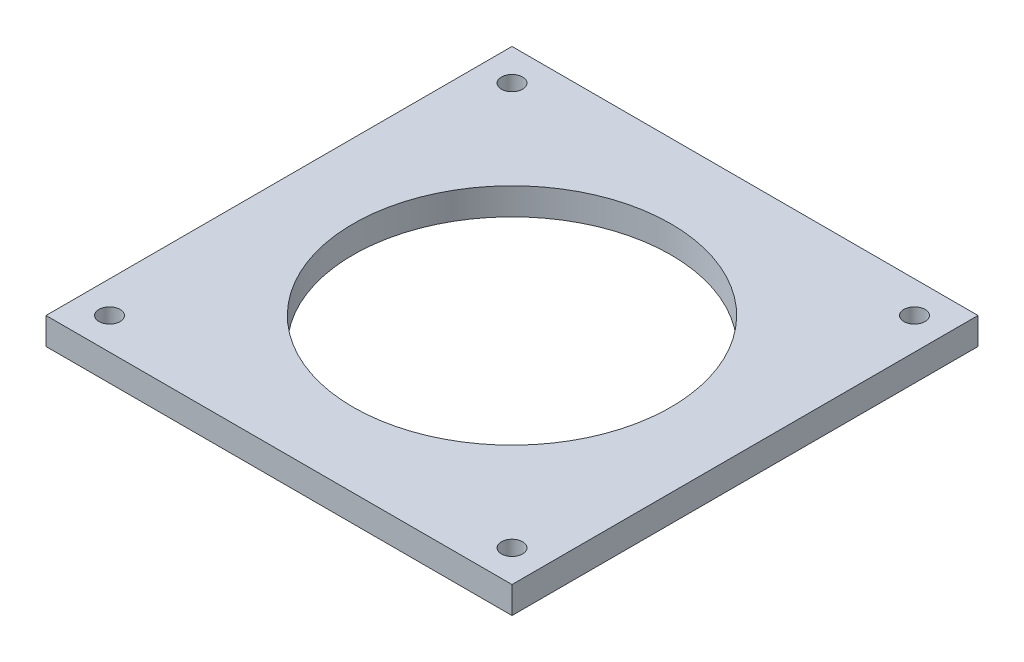
ISO-10303-21;
HEADER;
FILE_DESCRIPTION(('STEP AP214'),'2;1');
FILE_NAME('part.step','',(''),(''),'','','');
FILE_SCHEMA(('AUTOMOTIVE_DESIGN { 1 0 10303 214 1 1 1 1 }'));
ENDSEC;
DATA;
#1=APPLICATION_CONTEXT('core data for automotive mechanical design processes');
#2=APPLICATION_PROTOCOL_DEFINITION('international standard','automotive_design',2000,#1);
#3=PRODUCT_CONTEXT('',#1,'mechanical');
#4=PRODUCT('Part','Part','',(#3));
#5=PRODUCT_RELATED_PRODUCT_CATEGORY('part','',(#4));
#6=PRODUCT_DEFINITION_FORMATION('','',#4);
#7=PRODUCT_DEFINITION_CONTEXT('part definition',#1,'design');
#8=PRODUCT_DEFINITION('design','',#6,#7);
#9=PRODUCT_DEFINITION_SHAPE('','',#8);
#10=(LENGTH_UNIT() NAMED_UNIT(*) SI_UNIT(.MILLI.,.METRE.));
#11=(NAMED_UNIT(*) PLANE_ANGLE_UNIT() SI_UNIT($,.RADIAN.));
#12=(NAMED_UNIT(*) SI_UNIT($,.STERADIAN.) SOLID_ANGLE_UNIT());
#13=UNCERTAINTY_MEASURE_WITH_UNIT(LENGTH_MEASURE(1.E-05),#10,'distance_accuracy_value','');
#14=(GEOMETRIC_REPRESENTATION_CONTEXT(3) GLOBAL_UNCERTAINTY_ASSIGNED_CONTEXT((#13)) GLOBAL_UNIT_ASSIGNED_CONTEXT((#10,
#11,#12)) REPRESENTATION_CONTEXT('',''));
#15=CARTESIAN_POINT('',(0.,0.,0.));
#16=DIRECTION('',(0.,0.,1.));
#17=DIRECTION('',(1.,0.,0.));
#18=AXIS2_PLACEMENT_3D('',#15,#16,#17);
#19=CARTESIAN_POINT('',(0.,2.54,0.));
#20=DIRECTION('',(0.,1.,0.));
#21=DIRECTION('',(0.,0.,1.));
#22=AXIS2_PLACEMENT_3D('',#19,#20,#21);
#23=PLANE('',#22);
#24=DIRECTION('',(-1.,0.,0.));
#25=VECTOR('',#24,1.);
#26=CARTESIAN_POINT('',(-22.,2.54,22.));
#27=LINE('',#26,#25);
#28=CARTESIAN_POINT('',(22.,2.54,22.));
#29=VERTEX_POINT('',#28);
#30=CARTESIAN_POINT('',(-22.,2.54,22.));
#31=VERTEX_POINT('',#30);
#32=EDGE_CURVE('E79',#29,#31,#27,.T.);
#33=ORIENTED_EDGE('',*,*,#32,.F.);
#34=DIRECTION('',(0.,0.,1.));
#35=VECTOR('',#34,1.);
#36=CARTESIAN_POINT('',(22.,2.54,0.));
#37=LINE('',#36,#35);
#38=CARTESIAN_POINT('',(22.,2.54,-22.));
#39=VERTEX_POINT('',#38);
#40=EDGE_CURVE('E82',#39,#29,#37,.T.);
#41=ORIENTED_EDGE('',*,*,#40,.F.);
#42=DIRECTION('',(-1.,0.,0.));
#43=VECTOR('',#42,1.);
#44=CARTESIAN_POINT('',(-22.,2.54,-22.));
#45=LINE('',#44,#43);
#46=CARTESIAN_POINT('',(-22.,2.54,-22.));
#47=VERTEX_POINT('',#46);
#48=EDGE_CURVE('E132',#39,#47,#45,.T.);
#49=ORIENTED_EDGE('',*,*,#48,.T.);
#50=DIRECTION('',(0.,0.,1.));
#51=VECTOR('',#50,1.);
#52=CARTESIAN_POINT('',(-22.,2.54,0.));
#53=LINE('',#52,#51);
#54=EDGE_CURVE('E56',#47,#31,#53,.T.);
#55=ORIENTED_EDGE('',*,*,#54,.T.);
#56=EDGE_LOOP('',(#33,#41,#49,#55));
#57=FACE_BOUND('',#56,.T.);
#58=CARTESIAN_POINT('',(0.,2.54,0.));
#59=DIRECTION('',(0.,-1.,0.));
#60=DIRECTION('',(0.,0.,1.));
#61=AXIS2_PLACEMENT_3D('',#58,#59,#60);
#62=CIRCLE('',#61,15.);
#63=CARTESIAN_POINT('',(0.,2.54,15.));
#64=VERTEX_POINT('',#63);
#65=EDGE_CURVE('E51',#64,#64,#62,.T.);
#66=ORIENTED_EDGE('',*,*,#65,.T.);
#67=EDGE_LOOP('',(#66));
#68=FACE_BOUND('',#67,.T.);
#69=CARTESIAN_POINT('',(-19.,2.54,-19.));
#70=DIRECTION('',(0.,1.,0.));
#71=DIRECTION('',(0.,0.,1.));
#72=AXIS2_PLACEMENT_3D('',#69,#70,#71);
#73=CIRCLE('',#72,1.);
#74=CARTESIAN_POINT('',(-19.,2.54,-18.));
#75=VERTEX_POINT('',#74);
#76=EDGE_CURVE('E126',#75,#75,#73,.T.);
#77=ORIENTED_EDGE('',*,*,#76,.F.);
#78=EDGE_LOOP('',(#77));
#79=FACE_BOUND('',#78,.T.);
#80=CARTESIAN_POINT('',(-19.,2.54,19.));
#81=DIRECTION('',(0.,-1.,0.));
#82=DIRECTION('',(0.,0.,-1.));
#83=AXIS2_PLACEMENT_3D('',#80,#81,#82);
#84=CIRCLE('',#83,1.);
#85=CARTESIAN_POINT('',(-19.,2.54,18.));
#86=VERTEX_POINT('',#85);
#87=EDGE_CURVE('E118',#86,#86,#84,.T.);
#88=ORIENTED_EDGE('',*,*,#87,.T.);
#89=EDGE_LOOP('',(#88));
#90=FACE_BOUND('',#89,.T.);
#91=CARTESIAN_POINT('',(19.,2.54,-19.));
#92=DIRECTION('',(0.,-1.,0.));
#93=DIRECTION('',(0.,0.,1.));
#94=AXIS2_PLACEMENT_3D('',#91,#92,#93);
#95=CIRCLE('',#94,1.);
#96=CARTESIAN_POINT('',(19.,2.54,-18.));
#97=VERTEX_POINT('',#96);
#98=EDGE_CURVE('E106',#97,#97,#95,.T.);
#99=ORIENTED_EDGE('',*,*,#98,.T.);
#100=EDGE_LOOP('',(#99));
#101=FACE_BOUND('',#100,.T.);
#102=CARTESIAN_POINT('',(19.,2.54,19.));
#103=DIRECTION('',(0.,1.,0.));
#104=DIRECTION('',(0.,0.,-1.));
#105=AXIS2_PLACEMENT_3D('',#102,#103,#104);
#106=CIRCLE('',#105,1.);
#107=CARTESIAN_POINT('',(19.,2.54,18.));
#108=VERTEX_POINT('',#107);
#109=EDGE_CURVE('E103',#108,#108,#106,.T.);
#110=ORIENTED_EDGE('',*,*,#109,.F.);
#111=EDGE_LOOP('',(#110));
#112=FACE_BOUND('',#111,.T.);
#113=ADVANCED_FACE('F42',(#57,#68,#79,#90,#101,#112),#23,.T.);
#114=CARTESIAN_POINT('',(0.,0.,0.));
#115=DIRECTION('',(0.,1.,0.));
#116=DIRECTION('',(0.,0.,1.));
#117=AXIS2_PLACEMENT_3D('',#114,#115,#116);
#118=PLANE('',#117);
#119=DIRECTION('',(0.,0.,1.));
#120=VECTOR('',#119,1.);
#121=CARTESIAN_POINT('',(22.,0.,0.));
#122=LINE('',#121,#120);
#123=CARTESIAN_POINT('',(22.,0.,-22.));
#124=VERTEX_POINT('',#123);
#125=CARTESIAN_POINT('',(22.,0.,22.));
#126=VERTEX_POINT('',#125);
#127=EDGE_CURVE('E97',#124,#126,#122,.T.);
#128=ORIENTED_EDGE('',*,*,#127,.T.);
#129=DIRECTION('',(-1.,0.,0.));
#130=VECTOR('',#129,1.);
#131=CARTESIAN_POINT('',(-22.,0.,22.));
#132=LINE('',#131,#130);
#133=CARTESIAN_POINT('',(-22.,0.,22.));
#134=VERTEX_POINT('',#133);
#135=EDGE_CURVE('E87',#126,#134,#132,.T.);
#136=ORIENTED_EDGE('',*,*,#135,.T.);
#137=DIRECTION('',(0.,0.,1.));
#138=VECTOR('',#137,1.);
#139=CARTESIAN_POINT('',(-22.,0.,0.));
#140=LINE('',#139,#138);
#141=CARTESIAN_POINT('',(-22.,0.,-22.));
#142=VERTEX_POINT('',#141);
#143=EDGE_CURVE('E140',#142,#134,#140,.T.);
#144=ORIENTED_EDGE('',*,*,#143,.F.);
#145=DIRECTION('',(-1.,0.,0.));
#146=VECTOR('',#145,1.);
#147=CARTESIAN_POINT('',(-22.,0.,-22.));
#148=LINE('',#147,#146);
#149=EDGE_CURVE('E129',#124,#142,#148,.T.);
#150=ORIENTED_EDGE('',*,*,#149,.F.);
#151=EDGE_LOOP('',(#128,#136,#144,#150));
#152=FACE_BOUND('',#151,.T.);
#153=CARTESIAN_POINT('',(0.,0.,0.));
#154=DIRECTION('',(0.,-1.,0.));
#155=DIRECTION('',(0.,0.,1.));
#156=AXIS2_PLACEMENT_3D('',#153,#154,#155);
#157=CIRCLE('',#156,15.);
#158=CARTESIAN_POINT('',(0.,0.,15.));
#159=VERTEX_POINT('',#158);
#160=EDGE_CURVE('E134',#159,#159,#157,.T.);
#161=ORIENTED_EDGE('',*,*,#160,.F.);
#162=EDGE_LOOP('',(#161));
#163=FACE_BOUND('',#162,.T.);
#164=CARTESIAN_POINT('',(-19.,0.,-19.));
#165=DIRECTION('',(0.,1.,0.));
#166=DIRECTION('',(0.,0.,1.));
#167=AXIS2_PLACEMENT_3D('',#164,#165,#166);
#168=CIRCLE('',#167,1.);
#169=CARTESIAN_POINT('',(-19.,0.,-18.));
#170=VERTEX_POINT('',#169);
#171=EDGE_CURVE('E125',#170,#170,#168,.T.);
#172=ORIENTED_EDGE('',*,*,#171,.T.);
#173=EDGE_LOOP('',(#172));
#174=FACE_BOUND('',#173,.T.);
#175=CARTESIAN_POINT('',(-19.,0.,19.));
#176=DIRECTION('',(0.,-1.,0.));
#177=DIRECTION('',(0.,0.,-1.));
#178=AXIS2_PLACEMENT_3D('',#175,#176,#177);
#179=CIRCLE('',#178,1.);
#180=CARTESIAN_POINT('',(-19.,0.,18.));
#181=VERTEX_POINT('',#180);
#182=EDGE_CURVE('E117',#181,#181,#179,.T.);
#183=ORIENTED_EDGE('',*,*,#182,.F.);
#184=EDGE_LOOP('',(#183));
#185=FACE_BOUND('',#184,.T.);
#186=CARTESIAN_POINT('',(19.,0.,-19.));
#187=DIRECTION('',(0.,-1.,0.));
#188=DIRECTION('',(0.,0.,1.));
#189=AXIS2_PLACEMENT_3D('',#186,#187,#188);
#190=CIRCLE('',#189,1.);
#191=CARTESIAN_POINT('',(19.,0.,-18.));
#192=VERTEX_POINT('',#191);
#193=EDGE_CURVE('E102',#192,#192,#190,.T.);
#194=ORIENTED_EDGE('',*,*,#193,.F.);
#195=EDGE_LOOP('',(#194));
#196=FACE_BOUND('',#195,.T.);
#197=CARTESIAN_POINT('',(19.,0.,19.));
#198=DIRECTION('',(0.,1.,0.));
#199=DIRECTION('',(0.,0.,-1.));
#200=AXIS2_PLACEMENT_3D('',#197,#198,#199);
#201=CIRCLE('',#200,1.);
#202=CARTESIAN_POINT('',(19.,0.,18.));
#203=VERTEX_POINT('',#202);
#204=EDGE_CURVE('E109',#203,#203,#201,.T.);
#205=ORIENTED_EDGE('',*,*,#204,.T.);
#206=EDGE_LOOP('',(#205));
#207=FACE_BOUND('',#206,.T.);
#208=ADVANCED_FACE('F147',(#152,#163,#174,#185,#196,#207),#118,.F.);
#209=CARTESIAN_POINT('',(-22.,2.54,-22.));
#210=DIRECTION('',(0.,0.,1.));
#211=DIRECTION('',(1.,0.,0.));
#212=AXIS2_PLACEMENT_3D('',#209,#210,#211);
#213=PLANE('',#212);
#214=ORIENTED_EDGE('',*,*,#149,.T.);
#215=DIRECTION('',(0.,-1.,0.));
#216=VECTOR('',#215,1.);
#217=CARTESIAN_POINT('',(-22.,2.54,-22.));
#218=LINE('',#217,#216);
#219=EDGE_CURVE('E11',#47,#142,#218,.T.);
#220=ORIENTED_EDGE('',*,*,#219,.F.);
#221=ORIENTED_EDGE('',*,*,#48,.F.);
#222=DIRECTION('',(0.,-1.,0.));
#223=VECTOR('',#222,1.);
#224=CARTESIAN_POINT('',(22.,2.54,-22.));
#225=LINE('',#224,#223);
#226=EDGE_CURVE('E96',#39,#124,#225,.T.);
#227=ORIENTED_EDGE('',*,*,#226,.T.);
#228=EDGE_LOOP('',(#214,#220,#221,#227));
#229=FACE_BOUND('',#228,.T.);
#230=ADVANCED_FACE('F44',(#229),#213,.F.);
#231=CARTESIAN_POINT('',(-22.,2.54,0.));
#232=DIRECTION('',(1.,0.,0.));
#233=DIRECTION('',(0.,0.,-1.));
#234=AXIS2_PLACEMENT_3D('',#231,#232,#233);
#235=PLANE('',#234);
#236=ORIENTED_EDGE('',*,*,#143,.T.);
#237=DIRECTION('',(0.,-1.,0.));
#238=VECTOR('',#237,1.);
#239=CARTESIAN_POINT('',(-22.,2.54,22.));
#240=LINE('',#239,#238);
#241=EDGE_CURVE('E86',#31,#134,#240,.T.);
#242=ORIENTED_EDGE('',*,*,#241,.F.);
#243=ORIENTED_EDGE('',*,*,#54,.F.);
#244=ORIENTED_EDGE('',*,*,#219,.T.);
#245=EDGE_LOOP('',(#236,#242,#243,#244));
#246=FACE_BOUND('',#245,.T.);
#247=ADVANCED_FACE('F181',(#246),#235,.F.);
#248=CARTESIAN_POINT('',(0.,2.54,0.));
#249=DIRECTION('',(0.,-1.,0.));
#250=DIRECTION('',(0.,0.,-1.));
#251=AXIS2_PLACEMENT_3D('',#248,#249,#250);
#252=CYLINDRICAL_SURFACE('',#251,15.);
#253=ORIENTED_EDGE('',*,*,#160,.T.);
#254=EDGE_LOOP('',(#253));
#255=FACE_BOUND('',#254,.T.);
#256=ORIENTED_EDGE('',*,*,#65,.F.);
#257=EDGE_LOOP('',(#256));
#258=FACE_BOUND('',#257,.T.);
#259=ADVANCED_FACE('F144',(#255,#258),#252,.F.);
#260=CARTESIAN_POINT('',(-19.,2.54,-19.));
#261=DIRECTION('',(0.,-1.,0.));
#262=DIRECTION('',(0.,0.,-1.));
#263=AXIS2_PLACEMENT_3D('',#260,#261,#262);
#264=CYLINDRICAL_SURFACE('',#263,1.);
#265=ORIENTED_EDGE('',*,*,#76,.T.);
#266=EDGE_LOOP('',(#265));
#267=FACE_BOUND('',#266,.T.);
#268=ORIENTED_EDGE('',*,*,#171,.F.);
#269=EDGE_LOOP('',(#268));
#270=FACE_BOUND('',#269,.T.);
#271=ADVANCED_FACE('F177',(#267,#270),#264,.F.);
#272=CARTESIAN_POINT('',(-22.,2.54,22.));
#273=DIRECTION('',(0.,0.,1.));
#274=DIRECTION('',(1.,0.,0.));
#275=AXIS2_PLACEMENT_3D('',#272,#273,#274);
#276=PLANE('',#275);
#277=ORIENTED_EDGE('',*,*,#135,.F.);
#278=DIRECTION('',(0.,-1.,0.));
#279=VECTOR('',#278,1.);
#280=CARTESIAN_POINT('',(22.,2.54,22.));
#281=LINE('',#280,#279);
#282=EDGE_CURVE('E94',#29,#126,#281,.T.);
#283=ORIENTED_EDGE('',*,*,#282,.F.);
#284=ORIENTED_EDGE('',*,*,#32,.T.);
#285=ORIENTED_EDGE('',*,*,#241,.T.);
#286=EDGE_LOOP('',(#277,#283,#284,#285));
#287=FACE_BOUND('',#286,.T.);
#288=ADVANCED_FACE('F99',(#287),#276,.T.);
#289=CARTESIAN_POINT('',(-19.,2.54,19.));
#290=DIRECTION('',(0.,-1.,0.));
#291=DIRECTION('',(0.,0.,-1.));
#292=AXIS2_PLACEMENT_3D('',#289,#290,#291);
#293=CYLINDRICAL_SURFACE('',#292,1.);
#294=ORIENTED_EDGE('',*,*,#87,.F.);
#295=EDGE_LOOP('',(#294));
#296=FACE_BOUND('',#295,.T.);
#297=ORIENTED_EDGE('',*,*,#182,.T.);
#298=EDGE_LOOP('',(#297));
#299=FACE_BOUND('',#298,.T.);
#300=ADVANCED_FACE('F284',(#296,#299),#293,.F.);
#301=CARTESIAN_POINT('',(22.,2.54,0.));
#302=DIRECTION('',(1.,0.,0.));
#303=DIRECTION('',(0.,0.,-1.));
#304=AXIS2_PLACEMENT_3D('',#301,#302,#303);
#305=PLANE('',#304);
#306=ORIENTED_EDGE('',*,*,#127,.F.);
#307=ORIENTED_EDGE('',*,*,#226,.F.);
#308=ORIENTED_EDGE('',*,*,#40,.T.);
#309=ORIENTED_EDGE('',*,*,#282,.T.);
#310=EDGE_LOOP('',(#306,#307,#308,#309));
#311=FACE_BOUND('',#310,.T.);
#312=ADVANCED_FACE('F93',(#311),#305,.T.);
#313=CARTESIAN_POINT('',(19.,2.54,-19.));
#314=DIRECTION('',(0.,-1.,0.));
#315=DIRECTION('',(0.,0.,-1.));
#316=AXIS2_PLACEMENT_3D('',#313,#314,#315);
#317=CYLINDRICAL_SURFACE('',#316,1.);
#318=ORIENTED_EDGE('',*,*,#98,.F.);
#319=EDGE_LOOP('',(#318));
#320=FACE_BOUND('',#319,.T.);
#321=ORIENTED_EDGE('',*,*,#193,.T.);
#322=EDGE_LOOP('',(#321));
#323=FACE_BOUND('',#322,.T.);
#324=ADVANCED_FACE('F163',(#320,#323),#317,.F.);
#325=CARTESIAN_POINT('',(19.,2.54,19.));
#326=DIRECTION('',(0.,-1.,0.));
#327=DIRECTION('',(0.,0.,-1.));
#328=AXIS2_PLACEMENT_3D('',#325,#326,#327);
#329=CYLINDRICAL_SURFACE('',#328,1.);
#330=ORIENTED_EDGE('',*,*,#109,.T.);
#331=EDGE_LOOP('',(#330));
#332=FACE_BOUND('',#331,.T.);
#333=ORIENTED_EDGE('',*,*,#204,.F.);
#334=EDGE_LOOP('',(#333));
#335=FACE_BOUND('',#334,.T.);
#336=ADVANCED_FACE('F161',(#332,#335),#329,.F.);
#337=CLOSED_SHELL('',(#113,#208,#230,#247,#259,#271,#288,#300,#312,#324,#336));
#338=MANIFOLD_SOLID_BREP('B2',#337);
#339=ADVANCED_BREP_SHAPE_REPRESENTATION('',(#18,#338),#14);
#340=SHAPE_DEFINITION_REPRESENTATION(#9,#339);
ENDSEC;
END-ISO-10303-21;
